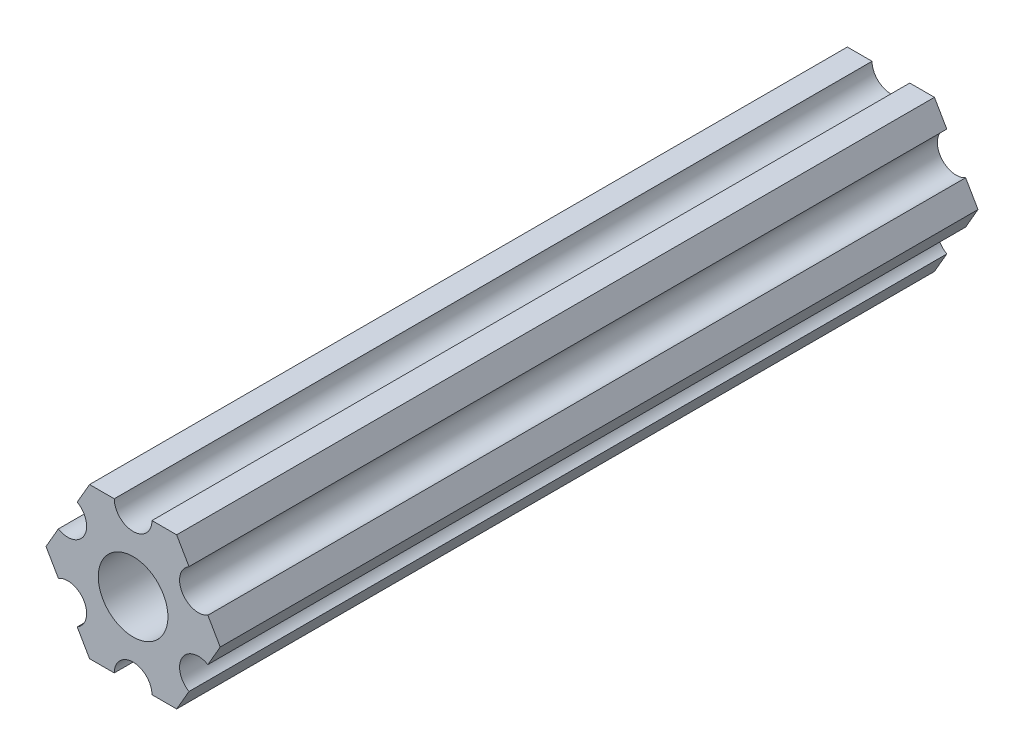
ISO-10303-21;
HEADER;
FILE_DESCRIPTION(('STEP AP214'),'2;1');
FILE_NAME('part.step','',(''),(''),'','','');
FILE_SCHEMA(('AUTOMOTIVE_DESIGN { 1 0 10303 214 1 1 1 1 }'));
ENDSEC;
DATA;
#1=APPLICATION_CONTEXT('core data for automotive mechanical design processes');
#2=APPLICATION_PROTOCOL_DEFINITION('international standard','automotive_design',2000,#1);
#3=PRODUCT_CONTEXT('',#1,'mechanical');
#4=PRODUCT('Part','Part','',(#3));
#5=PRODUCT_RELATED_PRODUCT_CATEGORY('part','',(#4));
#6=PRODUCT_DEFINITION_FORMATION('','',#4);
#7=PRODUCT_DEFINITION_CONTEXT('part definition',#1,'design');
#8=PRODUCT_DEFINITION('design','',#6,#7);
#9=PRODUCT_DEFINITION_SHAPE('','',#8);
#10=(LENGTH_UNIT() NAMED_UNIT(*) SI_UNIT(.MILLI.,.METRE.));
#11=(NAMED_UNIT(*) PLANE_ANGLE_UNIT() SI_UNIT($,.RADIAN.));
#12=(NAMED_UNIT(*) SI_UNIT($,.STERADIAN.) SOLID_ANGLE_UNIT());
#13=UNCERTAINTY_MEASURE_WITH_UNIT(LENGTH_MEASURE(1.E-05),#10,'distance_accuracy_value','');
#14=(GEOMETRIC_REPRESENTATION_CONTEXT(3) GLOBAL_UNCERTAINTY_ASSIGNED_CONTEXT((#13)) GLOBAL_UNIT_ASSIGNED_CONTEXT((#10,
#11,#12)) REPRESENTATION_CONTEXT('',''));
#15=CARTESIAN_POINT('',(0.,0.,0.));
#16=DIRECTION('',(0.,0.,1.));
#17=DIRECTION('',(1.,0.,0.));
#18=AXIS2_PLACEMENT_3D('',#15,#16,#17);
#19=CARTESIAN_POINT('',(5.49926150638083,-3.17499966684068,-63.79));
#20=DIRECTION('',(0.,0.,1.));
#21=DIRECTION('',(-1.,0.,0.));
#22=AXIS2_PLACEMENT_3D('',#19,#20,#21);
#23=CYLINDRICAL_SURFACE('',#22,1.58750000000001);
#24=CARTESIAN_POINT('',(5.49926150638083,-3.17499966684068,0.));
#25=DIRECTION('',(0.,0.,1.));
#26=DIRECTION('',(1.,0.,0.));
#27=AXIS2_PLACEMENT_3D('',#24,#25,#26);
#28=CIRCLE('',#27,1.58750000000001);
#29=CARTESIAN_POINT('',(6.29301142309098,-1.80018429024546,0.));
#30=VERTEX_POINT('',#29);
#31=CARTESIAN_POINT('',(4.70551158967068,-4.54981504343589,0.));
#32=VERTEX_POINT('',#31);
#33=EDGE_CURVE('E191',#30,#32,#28,.T.);
#34=ORIENTED_EDGE('',*,*,#33,.T.);
#35=DIRECTION('',(0.,0.,1.));
#36=VECTOR('',#35,1.);
#37=CARTESIAN_POINT('',(4.70551158967068,-4.54981504343589,-63.79));
#38=LINE('',#37,#36);
#39=CARTESIAN_POINT('',(4.70551158967068,-4.54981504343589,-63.79));
#40=VERTEX_POINT('',#39);
#41=EDGE_CURVE('E38',#40,#32,#38,.T.);
#42=ORIENTED_EDGE('',*,*,#41,.F.);
#43=CARTESIAN_POINT('',(5.49926150638083,-3.17499966684068,-63.79));
#44=DIRECTION('',(0.,0.,1.));
#45=DIRECTION('',(1.,0.,0.));
#46=AXIS2_PLACEMENT_3D('',#43,#44,#45);
#47=CIRCLE('',#46,1.58750000000001);
#48=CARTESIAN_POINT('',(6.29301142309098,-1.80018429024546,-63.79));
#49=VERTEX_POINT('',#48);
#50=EDGE_CURVE('E225',#49,#40,#47,.T.);
#51=ORIENTED_EDGE('',*,*,#50,.F.);
#52=DIRECTION('',(0.,0.,1.));
#53=VECTOR('',#52,1.);
#54=CARTESIAN_POINT('',(6.29301142309098,-1.80018429024546,-63.79));
#55=LINE('',#54,#53);
#56=EDGE_CURVE('E11',#49,#30,#55,.T.);
#57=ORIENTED_EDGE('',*,*,#56,.T.);
#58=EDGE_LOOP('',(#34,#42,#51,#57));
#59=FACE_BOUND('',#58,.T.);
#60=ADVANCED_FACE('F35',(#59),#23,.F.);
#61=CARTESIAN_POINT('',(7.33234841870826,4.44212518856872E-07,-63.79));
#62=DIRECTION('',(0.866025434075723,-0.499999947533953,0.));
#63=DIRECTION('',(0.499999947533953,0.866025434075723,0.));
#64=AXIS2_PLACEMENT_3D('',#61,#62,#63);
#65=PLANE('',#64);
#66=DIRECTION('',(-0.499999947533953,-0.866025434075723,0.));
#67=VECTOR('',#66,1.);
#68=CARTESIAN_POINT('',(7.33234841870826,4.44212518856872E-07,0.));
#69=LINE('',#68,#67);
#70=CARTESIAN_POINT('',(7.33234841870826,4.44212518856872E-07,0.));
#71=VERTEX_POINT('',#70);
#72=EDGE_CURVE('E118',#71,#30,#69,.T.);
#73=ORIENTED_EDGE('',*,*,#72,.T.);
#74=ORIENTED_EDGE('',*,*,#56,.F.);
#75=DIRECTION('',(-0.499999947533953,-0.866025434075723,0.));
#76=VECTOR('',#75,1.);
#77=CARTESIAN_POINT('',(7.33234841870826,4.44212518856872E-07,-63.79));
#78=LINE('',#77,#76);
#79=CARTESIAN_POINT('',(7.33234841870826,4.44212518856872E-07,-63.79));
#80=VERTEX_POINT('',#79);
#81=EDGE_CURVE('E53',#80,#49,#78,.T.);
#82=ORIENTED_EDGE('',*,*,#81,.F.);
#83=DIRECTION('',(0.,0.,1.));
#84=VECTOR('',#83,1.);
#85=CARTESIAN_POINT('',(7.33234841870826,4.44212518856872E-07,-63.79));
#86=LINE('',#85,#84);
#87=EDGE_CURVE('E44',#80,#71,#86,.T.);
#88=ORIENTED_EDGE('',*,*,#87,.T.);
#89=EDGE_LOOP('',(#73,#74,#82,#88));
#90=FACE_BOUND('',#89,.T.);
#91=ADVANCED_FACE('F370',(#90),#65,.T.);
#92=CARTESIAN_POINT('',(6.29301120497139,1.80018505273895,-63.79));
#93=DIRECTION('',(0.866025373493145,0.500000052466056,0.));
#94=DIRECTION('',(-0.500000052466056,0.866025373493145,0.));
#95=AXIS2_PLACEMENT_3D('',#92,#93,#94);
#96=PLANE('',#95);
#97=DIRECTION('',(0.500000052466056,-0.866025373493145,0.));
#98=VECTOR('',#97,1.);
#99=CARTESIAN_POINT('',(6.29301120497139,1.80018505273895,0.));
#100=LINE('',#99,#98);
#101=CARTESIAN_POINT('',(6.29301120497139,1.80018505273895,0.));
#102=VERTEX_POINT('',#101);
#103=EDGE_CURVE('E112',#102,#71,#100,.T.);
#104=ORIENTED_EDGE('',*,*,#103,.T.);
#105=ORIENTED_EDGE('',*,*,#87,.F.);
#106=DIRECTION('',(0.500000052466056,-0.866025373493145,0.));
#107=VECTOR('',#106,1.);
#108=CARTESIAN_POINT('',(6.29301120497139,1.80018505273895,-63.79));
#109=LINE('',#108,#107);
#110=CARTESIAN_POINT('',(6.29301120497139,1.80018505273895,-63.79));
#111=VERTEX_POINT('',#110);
#112=EDGE_CURVE('E173',#111,#80,#109,.T.);
#113=ORIENTED_EDGE('',*,*,#112,.F.);
#114=DIRECTION('',(0.,0.,1.));
#115=VECTOR('',#114,1.);
#116=CARTESIAN_POINT('',(6.29301120497139,1.80018505273895,-63.79));
#117=LINE('',#116,#115);
#118=EDGE_CURVE('E180',#111,#102,#117,.T.);
#119=ORIENTED_EDGE('',*,*,#118,.T.);
#120=EDGE_LOOP('',(#104,#105,#113,#119));
#121=FACE_BOUND('',#120,.T.);
#122=ADVANCED_FACE('F186',(#121),#96,.T.);
#123=CARTESIAN_POINT('',(5.49926112168152,3.17500033315931,-63.79));
#124=DIRECTION('',(0.,0.,1.));
#125=DIRECTION('',(-1.,0.,0.));
#126=AXIS2_PLACEMENT_3D('',#123,#124,#125);
#127=CYLINDRICAL_SURFACE('',#126,1.5875);
#128=CARTESIAN_POINT('',(5.49926112168152,3.17500033315931,0.));
#129=DIRECTION('',(0.,0.,1.));
#130=DIRECTION('',(1.,0.,0.));
#131=AXIS2_PLACEMENT_3D('',#128,#129,#130);
#132=CIRCLE('',#131,1.5875);
#133=CARTESIAN_POINT('',(4.70551103839166,4.54981561357968,0.));
#134=VERTEX_POINT('',#133);
#135=EDGE_CURVE('E183',#134,#102,#132,.T.);
#136=ORIENTED_EDGE('',*,*,#135,.T.);
#137=ORIENTED_EDGE('',*,*,#118,.F.);
#138=CARTESIAN_POINT('',(5.49926112168152,3.17500033315931,-63.79));
#139=DIRECTION('',(0.,0.,1.));
#140=DIRECTION('',(1.,0.,0.));
#141=AXIS2_PLACEMENT_3D('',#138,#139,#140);
#142=CIRCLE('',#141,1.5875);
#143=CARTESIAN_POINT('',(4.70551103839166,4.54981561357968,-63.79));
#144=VERTEX_POINT('',#143);
#145=EDGE_CURVE('E169',#144,#111,#142,.T.);
#146=ORIENTED_EDGE('',*,*,#145,.F.);
#147=DIRECTION('',(0.,0.,1.));
#148=VECTOR('',#147,1.);
#149=CARTESIAN_POINT('',(4.70551103839166,4.54981561357968,-63.79));
#150=LINE('',#149,#148);
#151=EDGE_CURVE('E184',#144,#134,#150,.T.);
#152=ORIENTED_EDGE('',*,*,#151,.T.);
#153=EDGE_LOOP('',(#136,#137,#146,#152));
#154=FACE_BOUND('',#153,.T.);
#155=ADVANCED_FACE('F181',(#154),#127,.F.);
#156=CARTESIAN_POINT('',(3.66617382465472,6.35000022210622,-63.79));
#157=DIRECTION('',(0.866025373493145,0.500000052466056,0.));
#158=DIRECTION('',(-0.500000052466056,0.866025373493145,0.));
#159=AXIS2_PLACEMENT_3D('',#156,#157,#158);
#160=PLANE('',#159);
#161=DIRECTION('',(0.500000052466056,-0.866025373493145,0.));
#162=VECTOR('',#161,1.);
#163=CARTESIAN_POINT('',(3.66617382465472,6.35000022210622,0.));
#164=LINE('',#163,#162);
#165=CARTESIAN_POINT('',(3.66617382465472,6.35000022210622,0.));
#166=VERTEX_POINT('',#165);
#167=EDGE_CURVE('E221',#166,#134,#164,.T.);
#168=ORIENTED_EDGE('',*,*,#167,.T.);
#169=ORIENTED_EDGE('',*,*,#151,.F.);
#170=DIRECTION('',(0.500000052466056,-0.866025373493145,0.));
#171=VECTOR('',#170,1.);
#172=CARTESIAN_POINT('',(3.66617382465472,6.35000022210622,-63.79));
#173=LINE('',#172,#171);
#174=CARTESIAN_POINT('',(3.66617382465472,6.35000022210622,-63.79));
#175=VERTEX_POINT('',#174);
#176=EDGE_CURVE('E175',#175,#144,#173,.T.);
#177=ORIENTED_EDGE('',*,*,#176,.F.);
#178=DIRECTION('',(0.,0.,1.));
#179=VECTOR('',#178,1.);
#180=CARTESIAN_POINT('',(3.66617382465472,6.35000022210622,-63.79));
#181=LINE('',#180,#179);
#182=EDGE_CURVE('E229',#175,#166,#181,.T.);
#183=ORIENTED_EDGE('',*,*,#182,.T.);
#184=EDGE_LOOP('',(#168,#169,#177,#183));
#185=FACE_BOUND('',#184,.T.);
#186=ADVANCED_FACE('F319',(#185),#160,.T.);
#187=CARTESIAN_POINT('',(1.58749961530066,6.35000022210623,-63.79));
#188=DIRECTION('',(0.,1.,0.));
#189=DIRECTION('',(-1.,0.,0.));
#190=AXIS2_PLACEMENT_3D('',#187,#188,#189);
#191=PLANE('',#190);
#192=DIRECTION('',(1.,0.,0.));
#193=VECTOR('',#192,1.);
#194=CARTESIAN_POINT('',(1.58749961530066,6.35000022210623,0.));
#195=LINE('',#194,#193);
#196=CARTESIAN_POINT('',(1.58749961530066,6.35000022210623,0.));
#197=VERTEX_POINT('',#196);
#198=EDGE_CURVE('E219',#197,#166,#195,.T.);
#199=ORIENTED_EDGE('',*,*,#198,.T.);
#200=ORIENTED_EDGE('',*,*,#182,.F.);
#201=DIRECTION('',(1.,0.,0.));
#202=VECTOR('',#201,1.);
#203=CARTESIAN_POINT('',(1.58749961530066,6.35000022210623,-63.79));
#204=LINE('',#203,#202);
#205=CARTESIAN_POINT('',(1.58749961530066,6.35000022210623,-63.79));
#206=VERTEX_POINT('',#205);
#207=EDGE_CURVE('E309',#206,#175,#204,.T.);
#208=ORIENTED_EDGE('',*,*,#207,.F.);
#209=DIRECTION('',(0.,0.,1.));
#210=VECTOR('',#209,1.);
#211=CARTESIAN_POINT('',(1.58749961530066,6.35000022210623,-63.79));
#212=LINE('',#211,#210);
#213=EDGE_CURVE('E232',#206,#197,#212,.T.);
#214=ORIENTED_EDGE('',*,*,#213,.T.);
#215=EDGE_LOOP('',(#199,#200,#208,#214));
#216=FACE_BOUND('',#215,.T.);
#217=ADVANCED_FACE('F315',(#216),#191,.T.);
#218=CARTESIAN_POINT('',(-3.84699344941095E-07,6.35000022210623,-63.79));
#219=DIRECTION('',(0.,0.,1.));
#220=DIRECTION('',(-1.,0.,0.));
#221=AXIS2_PLACEMENT_3D('',#218,#219,#220);
#222=CYLINDRICAL_SURFACE('',#221,1.5875);
#223=CARTESIAN_POINT('',(-3.84699344941095E-07,6.35000022210623,0.));
#224=DIRECTION('',(0.,0.,1.));
#225=DIRECTION('',(1.,0.,0.));
#226=AXIS2_PLACEMENT_3D('',#223,#224,#225);
#227=CIRCLE('',#226,1.5875);
#228=CARTESIAN_POINT('',(-1.58750038469935,6.35000022210623,0.));
#229=VERTEX_POINT('',#228);
#230=EDGE_CURVE('E217',#229,#197,#227,.T.);
#231=ORIENTED_EDGE('',*,*,#230,.T.);
#232=ORIENTED_EDGE('',*,*,#213,.F.);
#233=CARTESIAN_POINT('',(-3.84699344941095E-07,6.35000022210623,-63.79));
#234=DIRECTION('',(0.,0.,1.));
#235=DIRECTION('',(1.,0.,0.));
#236=AXIS2_PLACEMENT_3D('',#233,#234,#235);
#237=CIRCLE('',#236,1.5875);
#238=CARTESIAN_POINT('',(-1.58750038469935,6.35000022210623,-63.79));
#239=VERTEX_POINT('',#238);
#240=EDGE_CURVE('E307',#239,#206,#237,.T.);
#241=ORIENTED_EDGE('',*,*,#240,.F.);
#242=DIRECTION('',(0.,0.,1.));
#243=VECTOR('',#242,1.);
#244=CARTESIAN_POINT('',(-1.58750038469935,6.35000022210623,-63.79));
#245=LINE('',#244,#243);
#246=EDGE_CURVE('E235',#239,#229,#245,.T.);
#247=ORIENTED_EDGE('',*,*,#246,.T.);
#248=EDGE_LOOP('',(#231,#232,#241,#247));
#249=FACE_BOUND('',#248,.T.);
#250=ADVANCED_FACE('F324',(#249),#222,.F.);
#251=CARTESIAN_POINT('',(-3.66617452134701,6.35000022210623,-63.79));
#252=DIRECTION('',(0.,1.,0.));
#253=DIRECTION('',(0.,0.,-1.));
#254=AXIS2_PLACEMENT_3D('',#251,#252,#253);
#255=PLANE('',#254);
#256=DIRECTION('',(1.,0.,0.));
#257=VECTOR('',#256,1.);
#258=CARTESIAN_POINT('',(-3.66617452134701,6.35000022210623,0.));
#259=LINE('',#258,#257);
#260=CARTESIAN_POINT('',(-3.66617452134701,6.35000022210623,0.));
#261=VERTEX_POINT('',#260);
#262=EDGE_CURVE('E215',#261,#229,#259,.T.);
#263=ORIENTED_EDGE('',*,*,#262,.T.);
#264=ORIENTED_EDGE('',*,*,#246,.F.);
#265=DIRECTION('',(1.,0.,0.));
#266=VECTOR('',#265,1.);
#267=CARTESIAN_POINT('',(-3.66617452134701,6.35000022210623,-63.79));
#268=LINE('',#267,#266);
#269=CARTESIAN_POINT('',(-3.66617452134701,6.35000022210623,-63.79));
#270=VERTEX_POINT('',#269);
#271=EDGE_CURVE('E305',#270,#239,#268,.T.);
#272=ORIENTED_EDGE('',*,*,#271,.F.);
#273=DIRECTION('',(0.,0.,1.));
#274=VECTOR('',#273,1.);
#275=CARTESIAN_POINT('',(-3.66617452134701,6.35000022210623,-63.79));
#276=LINE('',#275,#274);
#277=EDGE_CURVE('E238',#270,#261,#276,.T.);
#278=ORIENTED_EDGE('',*,*,#277,.T.);
#279=EDGE_LOOP('',(#263,#264,#272,#278));
#280=FACE_BOUND('',#279,.T.);
#281=ADVANCED_FACE('F328',(#280),#255,.T.);
#282=CARTESIAN_POINT('',(-4.70551145677116,4.54981548085265,-63.79));
#283=DIRECTION('',(-0.866025447431971,0.499999924400249,0.));
#284=DIRECTION('',(-0.499999924400249,-0.866025447431971,0.));
#285=AXIS2_PLACEMENT_3D('',#282,#283,#284);
#286=PLANE('',#285);
#287=DIRECTION('',(0.499999924400249,0.866025447431971,0.));
#288=VECTOR('',#287,1.);
#289=CARTESIAN_POINT('',(-4.70551145677116,4.54981548085265,0.));
#290=LINE('',#289,#288);
#291=CARTESIAN_POINT('',(-4.70551145677116,4.54981548085265,0.));
#292=VERTEX_POINT('',#291);
#293=EDGE_CURVE('E213',#292,#261,#290,.T.);
#294=ORIENTED_EDGE('',*,*,#293,.T.);
#295=ORIENTED_EDGE('',*,*,#277,.F.);
#296=DIRECTION('',(0.499999924400249,0.866025447431971,0.));
#297=VECTOR('',#296,1.);
#298=CARTESIAN_POINT('',(-4.70551145677116,4.54981548085265,-63.79));
#299=LINE('',#298,#297);
#300=CARTESIAN_POINT('',(-4.70551145677116,4.54981548085265,-63.79));
#301=VERTEX_POINT('',#300);
#302=EDGE_CURVE('E303',#301,#270,#299,.T.);
#303=ORIENTED_EDGE('',*,*,#302,.F.);
#304=DIRECTION('',(0.,0.,1.));
#305=VECTOR('',#304,1.);
#306=CARTESIAN_POINT('',(-4.70551145677116,4.54981548085265,-63.79));
#307=LINE('',#306,#305);
#308=EDGE_CURVE('E241',#301,#292,#307,.T.);
#309=ORIENTED_EDGE('',*,*,#308,.T.);
#310=EDGE_LOOP('',(#294,#295,#303,#309));
#311=FACE_BOUND('',#310,.T.);
#312=ADVANCED_FACE('F332',(#311),#286,.T.);
#313=CARTESIAN_POINT('',(-5.49926133675655,3.17500008305439,-63.79));
#314=DIRECTION('',(0.,0.,1.));
#315=DIRECTION('',(-1.,0.,0.));
#316=AXIS2_PLACEMENT_3D('',#313,#314,#315);
#317=CYLINDRICAL_SURFACE('',#316,1.5875);
#318=CARTESIAN_POINT('',(-5.49926133675655,3.17500008305439,0.));
#319=DIRECTION('',(0.,0.,1.));
#320=DIRECTION('',(1.,0.,0.));
#321=AXIS2_PLACEMENT_3D('',#318,#319,#320);
#322=CIRCLE('',#321,1.5875);
#323=CARTESIAN_POINT('',(-6.29301121674195,1.80018468525613,0.));
#324=VERTEX_POINT('',#323);
#325=EDGE_CURVE('E211',#324,#292,#322,.T.);
#326=ORIENTED_EDGE('',*,*,#325,.T.);
#327=ORIENTED_EDGE('',*,*,#308,.F.);
#328=CARTESIAN_POINT('',(-5.49926133675655,3.17500008305439,-63.79));
#329=DIRECTION('',(0.,0.,1.));
#330=DIRECTION('',(1.,0.,0.));
#331=AXIS2_PLACEMENT_3D('',#328,#329,#330);
#332=CIRCLE('',#331,1.5875);
#333=CARTESIAN_POINT('',(-6.29301121674195,1.80018468525613,-63.79));
#334=VERTEX_POINT('',#333);
#335=EDGE_CURVE('E301',#334,#301,#332,.T.);
#336=ORIENTED_EDGE('',*,*,#335,.F.);
#337=DIRECTION('',(0.,0.,1.));
#338=VECTOR('',#337,1.);
#339=CARTESIAN_POINT('',(-6.29301121674195,1.80018468525613,-63.79));
#340=LINE('',#339,#338);
#341=EDGE_CURVE('E244',#334,#324,#340,.T.);
#342=ORIENTED_EDGE('',*,*,#341,.T.);
#343=EDGE_LOOP('',(#326,#327,#336,#342));
#344=FACE_BOUND('',#343,.T.);
#345=ADVANCED_FACE('F338',(#344),#317,.F.);
#346=CARTESIAN_POINT('',(-7.33234807945963,6.99338729030344E-08,-63.79));
#347=DIRECTION('',(-0.866025447431971,0.499999924400249,0.));
#348=DIRECTION('',(-0.499999924400249,-0.866025447431971,0.));
#349=AXIS2_PLACEMENT_3D('',#346,#347,#348);
#350=PLANE('',#349);
#351=DIRECTION('',(0.499999924400249,0.866025447431971,0.));
#352=VECTOR('',#351,1.);
#353=CARTESIAN_POINT('',(-7.33234807945963,6.99338729030344E-08,0.));
#354=LINE('',#353,#352);
#355=CARTESIAN_POINT('',(-7.33234807945963,6.99338729030344E-08,0.));
#356=VERTEX_POINT('',#355);
#357=EDGE_CURVE('E209',#356,#324,#354,.T.);
#358=ORIENTED_EDGE('',*,*,#357,.T.);
#359=ORIENTED_EDGE('',*,*,#341,.F.);
#360=DIRECTION('',(0.499999924400249,0.866025447431971,0.));
#361=VECTOR('',#360,1.);
#362=CARTESIAN_POINT('',(-7.33234807945963,6.99338729030344E-08,-63.79));
#363=LINE('',#362,#361);
#364=CARTESIAN_POINT('',(-7.33234807945963,6.99338729030344E-08,-63.79));
#365=VERTEX_POINT('',#364);
#366=EDGE_CURVE('E299',#365,#334,#363,.T.);
#367=ORIENTED_EDGE('',*,*,#366,.F.);
#368=DIRECTION('',(0.,0.,1.));
#369=VECTOR('',#368,1.);
#370=CARTESIAN_POINT('',(-7.33234807945963,6.99338729030344E-08,-63.79));
#371=LINE('',#370,#369);
#372=EDGE_CURVE('E247',#365,#356,#371,.T.);
#373=ORIENTED_EDGE('',*,*,#372,.T.);
#374=EDGE_LOOP('',(#358,#359,#367,#373));
#375=FACE_BOUND('',#374,.T.);
#376=ADVANCED_FACE('F343',(#375),#350,.T.);
#377=CARTESIAN_POINT('',(-6.29301096189761,-1.80018459411914,-63.79));
#378=DIRECTION('',(-0.866025400205645,-0.500000006198653,0.));
#379=DIRECTION('',(0.500000006198653,-0.866025400205645,0.));
#380=AXIS2_PLACEMENT_3D('',#377,#378,#379);
#381=PLANE('',#380);
#382=DIRECTION('',(-0.500000006198653,0.866025400205645,0.));
#383=VECTOR('',#382,1.);
#384=CARTESIAN_POINT('',(-6.29301096189761,-1.80018459411914,0.));
#385=LINE('',#384,#383);
#386=CARTESIAN_POINT('',(-6.29301096189761,-1.80018459411914,0.));
#387=VERTEX_POINT('',#386);
#388=EDGE_CURVE('E207',#387,#356,#385,.T.);
#389=ORIENTED_EDGE('',*,*,#388,.T.);
#390=ORIENTED_EDGE('',*,*,#372,.F.);
#391=DIRECTION('',(-0.500000006198653,0.866025400205645,0.));
#392=VECTOR('',#391,1.);
#393=CARTESIAN_POINT('',(-6.29301096189761,-1.80018459411914,-63.79));
#394=LINE('',#393,#392);
#395=CARTESIAN_POINT('',(-6.29301096189761,-1.80018459411914,-63.79));
#396=VERTEX_POINT('',#395);
#397=EDGE_CURVE('E297',#396,#365,#394,.T.);
#398=ORIENTED_EDGE('',*,*,#397,.F.);
#399=DIRECTION('',(0.,0.,1.));
#400=VECTOR('',#399,1.);
#401=CARTESIAN_POINT('',(-6.29301096189761,-1.80018459411914,-63.79));
#402=LINE('',#401,#400);
#403=EDGE_CURVE('E250',#396,#387,#402,.T.);
#404=ORIENTED_EDGE('',*,*,#403,.T.);
#405=EDGE_LOOP('',(#389,#390,#398,#404));
#406=FACE_BOUND('',#405,.T.);
#407=ADVANCED_FACE('F347',(#406),#381,.T.);
#408=CARTESIAN_POINT('',(-5.49926095205725,-3.1749999169456,-63.79));
#409=DIRECTION('',(0.,0.,1.));
#410=DIRECTION('',(-1.,0.,0.));
#411=AXIS2_PLACEMENT_3D('',#408,#409,#410);
#412=CYLINDRICAL_SURFACE('',#411,1.5875);
#413=CARTESIAN_POINT('',(-5.49926095205725,-3.1749999169456,0.));
#414=DIRECTION('',(0.,0.,1.));
#415=DIRECTION('',(1.,0.,0.));
#416=AXIS2_PLACEMENT_3D('',#413,#414,#415);
#417=CIRCLE('',#416,1.5875);
#418=CARTESIAN_POINT('',(-4.70551094221689,-4.54981523977206,0.));
#419=VERTEX_POINT('',#418);
#420=EDGE_CURVE('E205',#419,#387,#417,.T.);
#421=ORIENTED_EDGE('',*,*,#420,.T.);
#422=ORIENTED_EDGE('',*,*,#403,.F.);
#423=CARTESIAN_POINT('',(-5.49926095205725,-3.1749999169456,-63.79));
#424=DIRECTION('',(0.,0.,1.));
#425=DIRECTION('',(1.,0.,0.));
#426=AXIS2_PLACEMENT_3D('',#423,#424,#425);
#427=CIRCLE('',#426,1.5875);
#428=CARTESIAN_POINT('',(-4.70551094221689,-4.54981523977206,-63.79));
#429=VERTEX_POINT('',#428);
#430=EDGE_CURVE('E295',#429,#396,#427,.T.);
#431=ORIENTED_EDGE('',*,*,#430,.F.);
#432=DIRECTION('',(0.,0.,1.));
#433=VECTOR('',#432,1.);
#434=CARTESIAN_POINT('',(-4.70551094221689,-4.54981523977206,-63.79));
#435=LINE('',#434,#433);
#436=EDGE_CURVE('E253',#429,#419,#435,.T.);
#437=ORIENTED_EDGE('',*,*,#436,.T.);
#438=EDGE_LOOP('',(#421,#422,#431,#437));
#439=FACE_BOUND('',#438,.T.);
#440=ADVANCED_FACE('F352',(#439),#412,.F.);
#441=CARTESIAN_POINT('',(-3.66617382465481,-6.34999990382519,-63.79));
#442=DIRECTION('',(-0.866025400205645,-0.500000006198653,0.));
#443=DIRECTION('',(0.500000006198653,-0.866025400205645,0.));
#444=AXIS2_PLACEMENT_3D('',#441,#442,#443);
#445=PLANE('',#444);
#446=DIRECTION('',(-0.500000006198653,0.866025400205644,0.));
#447=VECTOR('',#446,1.);
#448=CARTESIAN_POINT('',(-3.66617382465481,-6.34999990382519,0.));
#449=LINE('',#448,#447);
#450=CARTESIAN_POINT('',(-3.66617382465481,-6.34999990382519,0.));
#451=VERTEX_POINT('',#450);
#452=EDGE_CURVE('E203',#451,#419,#449,.T.);
#453=ORIENTED_EDGE('',*,*,#452,.T.);
#454=ORIENTED_EDGE('',*,*,#436,.F.);
#455=DIRECTION('',(-0.500000006198653,0.866025400205644,0.));
#456=VECTOR('',#455,1.);
#457=CARTESIAN_POINT('',(-3.66617382465481,-6.34999990382519,-63.79));
#458=LINE('',#457,#456);
#459=CARTESIAN_POINT('',(-3.66617382465481,-6.34999990382519,-63.79));
#460=VERTEX_POINT('',#459);
#461=EDGE_CURVE('E289',#460,#429,#458,.T.);
#462=ORIENTED_EDGE('',*,*,#461,.F.);
#463=DIRECTION('',(0.,0.,1.));
#464=VECTOR('',#463,1.);
#465=CARTESIAN_POINT('',(-3.66617382465481,-6.34999990382519,-63.79));
#466=LINE('',#465,#464);
#467=EDGE_CURVE('E256',#460,#451,#466,.T.);
#468=ORIENTED_EDGE('',*,*,#467,.T.);
#469=EDGE_LOOP('',(#453,#454,#462,#468));
#470=FACE_BOUND('',#469,.T.);
#471=ADVANCED_FACE('F357',(#470),#445,.T.);
#472=CARTESIAN_POINT('',(-1.58749961530074,-6.34999990382519,-63.79));
#473=DIRECTION('',(0.,-1.,0.));
#474=DIRECTION('',(1.,0.,0.));
#475=AXIS2_PLACEMENT_3D('',#472,#473,#474);
#476=PLANE('',#475);
#477=DIRECTION('',(-1.,0.,0.));
#478=VECTOR('',#477,1.);
#479=CARTESIAN_POINT('',(-1.58749961530074,-6.34999990382519,0.));
#480=LINE('',#479,#478);
#481=CARTESIAN_POINT('',(-1.58749961530074,-6.34999990382519,0.));
#482=VERTEX_POINT('',#481);
#483=EDGE_CURVE('E201',#482,#451,#480,.T.);
#484=ORIENTED_EDGE('',*,*,#483,.T.);
#485=ORIENTED_EDGE('',*,*,#467,.F.);
#486=DIRECTION('',(-1.,0.,0.));
#487=VECTOR('',#486,1.);
#488=CARTESIAN_POINT('',(-1.58749961530074,-6.34999990382519,-63.79));
#489=LINE('',#488,#487);
#490=CARTESIAN_POINT('',(-1.58749961530074,-6.34999990382519,-63.79));
#491=VERTEX_POINT('',#490);
#492=EDGE_CURVE('E286',#491,#460,#489,.T.);
#493=ORIENTED_EDGE('',*,*,#492,.F.);
#494=DIRECTION('',(0.,0.,1.));
#495=VECTOR('',#494,1.);
#496=CARTESIAN_POINT('',(-1.58749961530074,-6.34999990382519,-63.79));
#497=LINE('',#496,#495);
#498=EDGE_CURVE('E259',#491,#482,#497,.T.);
#499=ORIENTED_EDGE('',*,*,#498,.T.);
#500=EDGE_LOOP('',(#484,#485,#493,#499));
#501=FACE_BOUND('',#500,.T.);
#502=ADVANCED_FACE('F360',(#501),#476,.T.);
#503=CARTESIAN_POINT('',(3.8469926204343E-07,-6.34999990382519,-63.79));
#504=DIRECTION('',(0.,0.,1.));
#505=DIRECTION('',(-1.,0.,0.));
#506=AXIS2_PLACEMENT_3D('',#503,#504,#505);
#507=CYLINDRICAL_SURFACE('',#506,1.5875);
#508=CARTESIAN_POINT('',(3.8469926204343E-07,-6.34999990382519,0.));
#509=DIRECTION('',(0.,0.,1.));
#510=DIRECTION('',(1.,0.,0.));
#511=AXIS2_PLACEMENT_3D('',#508,#509,#510);
#512=CIRCLE('',#511,1.5875);
#513=CARTESIAN_POINT('',(1.58750038469926,-6.34999990382518,0.));
#514=VERTEX_POINT('',#513);
#515=EDGE_CURVE('E199',#514,#482,#512,.T.);
#516=ORIENTED_EDGE('',*,*,#515,.T.);
#517=ORIENTED_EDGE('',*,*,#498,.F.);
#518=CARTESIAN_POINT('',(3.8469926204343E-07,-6.34999990382519,-63.79));
#519=DIRECTION('',(0.,0.,1.));
#520=DIRECTION('',(1.,0.,0.));
#521=AXIS2_PLACEMENT_3D('',#518,#519,#520);
#522=CIRCLE('',#521,1.5875);
#523=CARTESIAN_POINT('',(1.58750038469926,-6.34999990382518,-63.79));
#524=VERTEX_POINT('',#523);
#525=EDGE_CURVE('E284',#524,#491,#522,.T.);
#526=ORIENTED_EDGE('',*,*,#525,.F.);
#527=DIRECTION('',(0.,0.,1.));
#528=VECTOR('',#527,1.);
#529=CARTESIAN_POINT('',(1.58750038469926,-6.34999990382518,-63.79));
#530=LINE('',#529,#528);
#531=EDGE_CURVE('E262',#524,#514,#530,.T.);
#532=ORIENTED_EDGE('',*,*,#531,.T.);
#533=EDGE_LOOP('',(#516,#517,#526,#532));
#534=FACE_BOUND('',#533,.T.);
#535=ADVANCED_FACE('F282',(#534),#507,.F.);
#536=CARTESIAN_POINT('',(3.66617452134693,-6.34999990382519,-63.79));
#537=DIRECTION('',(0.,-1.,0.));
#538=DIRECTION('',(1.,0.,0.));
#539=AXIS2_PLACEMENT_3D('',#536,#537,#538);
#540=PLANE('',#539);
#541=DIRECTION('',(-1.,0.,0.));
#542=VECTOR('',#541,1.);
#543=CARTESIAN_POINT('',(3.66617452134693,-6.34999990382519,0.));
#544=LINE('',#543,#542);
#545=CARTESIAN_POINT('',(3.66617452134693,-6.34999990382519,0.));
#546=VERTEX_POINT('',#545);
#547=EDGE_CURVE('E197',#546,#514,#544,.T.);
#548=ORIENTED_EDGE('',*,*,#547,.T.);
#549=ORIENTED_EDGE('',*,*,#531,.F.);
#550=DIRECTION('',(-1.,0.,0.));
#551=VECTOR('',#550,1.);
#552=CARTESIAN_POINT('',(3.66617452134693,-6.34999990382519,-63.79));
#553=LINE('',#552,#551);
#554=CARTESIAN_POINT('',(3.66617452134693,-6.34999990382519,-63.79));
#555=VERTEX_POINT('',#554);
#556=EDGE_CURVE('E287',#555,#524,#553,.T.);
#557=ORIENTED_EDGE('',*,*,#556,.F.);
#558=DIRECTION('',(0.,0.,1.));
#559=VECTOR('',#558,1.);
#560=CARTESIAN_POINT('',(3.66617452134693,-6.34999990382519,-63.79));
#561=LINE('',#560,#559);
#562=EDGE_CURVE('E264',#555,#546,#561,.T.);
#563=ORIENTED_EDGE('',*,*,#562,.T.);
#564=EDGE_LOOP('',(#548,#549,#557,#563));
#565=FACE_BOUND('',#564,.T.);
#566=ADVANCED_FACE('F279',(#565),#540,.T.);
#567=CARTESIAN_POINT('',(4.70551158967068,-4.54981504343589,-63.79));
#568=DIRECTION('',(0.866025434075723,-0.499999947533953,0.));
#569=DIRECTION('',(0.499999947533953,0.866025434075723,0.));
#570=AXIS2_PLACEMENT_3D('',#567,#568,#569);
#571=PLANE('',#570);
#572=DIRECTION('',(-0.499999947533953,-0.866025434075723,0.));
#573=VECTOR('',#572,1.);
#574=CARTESIAN_POINT('',(4.70551158967068,-4.54981504343589,0.));
#575=LINE('',#574,#573);
#576=EDGE_CURVE('E194',#32,#546,#575,.T.);
#577=ORIENTED_EDGE('',*,*,#576,.T.);
#578=ORIENTED_EDGE('',*,*,#562,.F.);
#579=DIRECTION('',(-0.499999947533953,-0.866025434075723,0.));
#580=VECTOR('',#579,1.);
#581=CARTESIAN_POINT('',(4.70551158967068,-4.54981504343589,-63.79));
#582=LINE('',#581,#580);
#583=EDGE_CURVE('E126',#40,#555,#582,.T.);
#584=ORIENTED_EDGE('',*,*,#583,.F.);
#585=ORIENTED_EDGE('',*,*,#41,.T.);
#586=EDGE_LOOP('',(#577,#578,#584,#585));
#587=FACE_BOUND('',#586,.T.);
#588=ADVANCED_FACE('F270',(#587),#571,.T.);
#589=CARTESIAN_POINT('',(5.49926150638083,-3.17499966684068,-63.79));
#590=DIRECTION('',(0.,0.,-1.));
#591=DIRECTION('',(1.,0.,0.));
#592=AXIS2_PLACEMENT_3D('',#589,#590,#591);
#593=PLANE('',#592);
#594=CARTESIAN_POINT('',(0.,0.,-63.79));
#595=DIRECTION('',(0.,0.,-1.));
#596=DIRECTION('',(1.,0.,0.));
#597=AXIS2_PLACEMENT_3D('',#594,#595,#596);
#598=CIRCLE('',#597,2.9337);
#599=CARTESIAN_POINT('',(2.9337,0.,-63.79));
#600=VERTEX_POINT('',#599);
#601=EDGE_CURVE('E195',#600,#600,#598,.T.);
#602=ORIENTED_EDGE('',*,*,#601,.F.);
#603=EDGE_LOOP('',(#602));
#604=FACE_BOUND('',#603,.T.);
#605=ORIENTED_EDGE('',*,*,#50,.T.);
#606=ORIENTED_EDGE('',*,*,#583,.T.);
#607=ORIENTED_EDGE('',*,*,#556,.T.);
#608=ORIENTED_EDGE('',*,*,#525,.T.);
#609=ORIENTED_EDGE('',*,*,#492,.T.);
#610=ORIENTED_EDGE('',*,*,#461,.T.);
#611=ORIENTED_EDGE('',*,*,#430,.T.);
#612=ORIENTED_EDGE('',*,*,#397,.T.);
#613=ORIENTED_EDGE('',*,*,#366,.T.);
#614=ORIENTED_EDGE('',*,*,#335,.T.);
#615=ORIENTED_EDGE('',*,*,#302,.T.);
#616=ORIENTED_EDGE('',*,*,#271,.T.);
#617=ORIENTED_EDGE('',*,*,#240,.T.);
#618=ORIENTED_EDGE('',*,*,#207,.T.);
#619=ORIENTED_EDGE('',*,*,#176,.T.);
#620=ORIENTED_EDGE('',*,*,#145,.T.);
#621=ORIENTED_EDGE('',*,*,#112,.T.);
#622=ORIENTED_EDGE('',*,*,#81,.T.);
#623=EDGE_LOOP('',(#605,#606,#607,#608,#609,#610,#611,#612,#613,#614,#615,#616,#617,#618,#619,
#620,#621,#622));
#624=FACE_BOUND('',#623,.T.);
#625=ADVANCED_FACE('F171',(#604,#624),#593,.T.);
#626=CARTESIAN_POINT('',(5.49926150638083,-3.17499966684068,0.));
#627=DIRECTION('',(0.,0.,-1.));
#628=DIRECTION('',(1.,0.,0.));
#629=AXIS2_PLACEMENT_3D('',#626,#627,#628);
#630=PLANE('',#629);
#631=CARTESIAN_POINT('',(0.,0.,0.));
#632=DIRECTION('',(0.,0.,-1.));
#633=DIRECTION('',(1.,0.,0.));
#634=AXIS2_PLACEMENT_3D('',#631,#632,#633);
#635=CIRCLE('',#634,2.9337);
#636=CARTESIAN_POINT('',(2.9337,0.,0.));
#637=VERTEX_POINT('',#636);
#638=EDGE_CURVE('E469',#637,#637,#635,.T.);
#639=ORIENTED_EDGE('',*,*,#638,.T.);
#640=EDGE_LOOP('',(#639));
#641=FACE_BOUND('',#640,.T.);
#642=ORIENTED_EDGE('',*,*,#33,.F.);
#643=ORIENTED_EDGE('',*,*,#72,.F.);
#644=ORIENTED_EDGE('',*,*,#103,.F.);
#645=ORIENTED_EDGE('',*,*,#135,.F.);
#646=ORIENTED_EDGE('',*,*,#167,.F.);
#647=ORIENTED_EDGE('',*,*,#198,.F.);
#648=ORIENTED_EDGE('',*,*,#230,.F.);
#649=ORIENTED_EDGE('',*,*,#262,.F.);
#650=ORIENTED_EDGE('',*,*,#293,.F.);
#651=ORIENTED_EDGE('',*,*,#325,.F.);
#652=ORIENTED_EDGE('',*,*,#357,.F.);
#653=ORIENTED_EDGE('',*,*,#388,.F.);
#654=ORIENTED_EDGE('',*,*,#420,.F.);
#655=ORIENTED_EDGE('',*,*,#452,.F.);
#656=ORIENTED_EDGE('',*,*,#483,.F.);
#657=ORIENTED_EDGE('',*,*,#515,.F.);
#658=ORIENTED_EDGE('',*,*,#547,.F.);
#659=ORIENTED_EDGE('',*,*,#576,.F.);
#660=EDGE_LOOP('',(#642,#643,#644,#645,#646,#647,#648,#649,#650,#651,#652,#653,#654,#655,#656,
#657,#658,#659));
#661=FACE_BOUND('',#660,.T.);
#662=ADVANCED_FACE('F275',(#641,#661),#630,.F.);
#663=CARTESIAN_POINT('',(0.,0.,-63.79));
#664=DIRECTION('',(0.,0.,1.));
#665=DIRECTION('',(-1.,0.,0.));
#666=AXIS2_PLACEMENT_3D('',#663,#664,#665);
#667=CYLINDRICAL_SURFACE('',#666,2.9337);
#668=ORIENTED_EDGE('',*,*,#601,.T.);
#669=EDGE_LOOP('',(#668));
#670=FACE_BOUND('',#669,.T.);
#671=ORIENTED_EDGE('',*,*,#638,.F.);
#672=EDGE_LOOP('',(#671));
#673=FACE_BOUND('',#672,.T.);
#674=ADVANCED_FACE('F451',(#670,#673),#667,.F.);
#675=CLOSED_SHELL('',(#60,#91,#122,#155,#186,#217,#250,#281,#312,#345,#376,#407,#440,#471,#502,
#535,#566,#588,#625,#662,#674));
#676=MANIFOLD_SOLID_BREP('B2',#675);
#677=ADVANCED_BREP_SHAPE_REPRESENTATION('',(#18,#676),#14);
#678=SHAPE_DEFINITION_REPRESENTATION(#9,#677);
ENDSEC;
END-ISO-10303-21;
